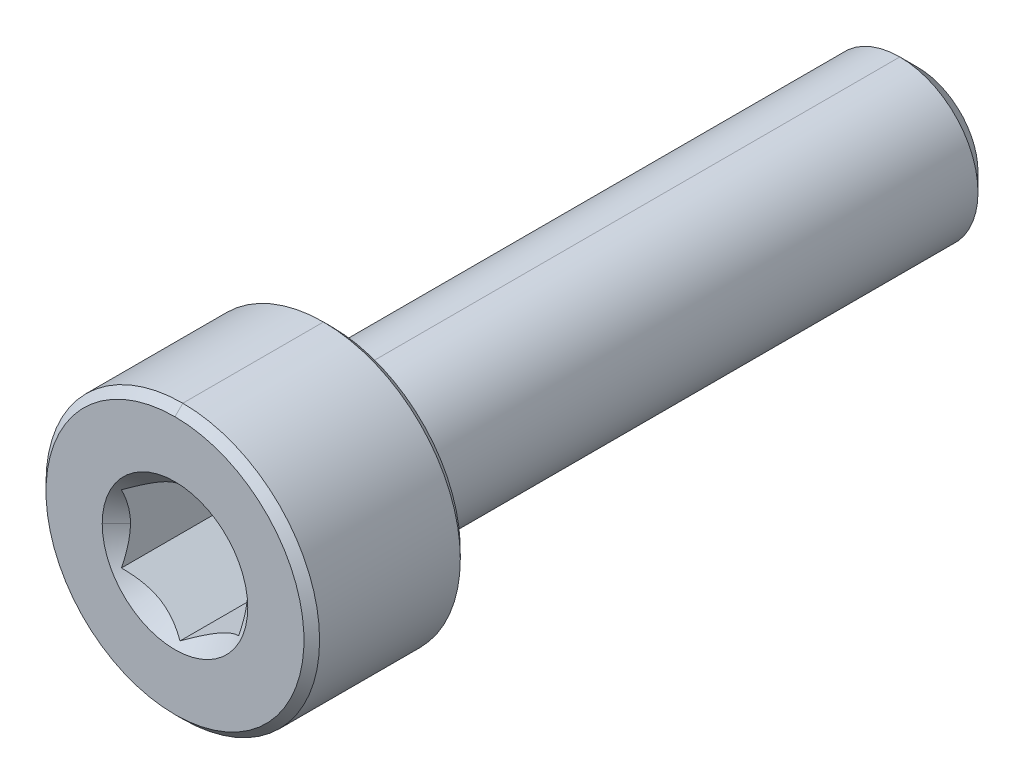
ISO-10303-21;
HEADER;
FILE_DESCRIPTION(('STEP AP214'),'2;1');
FILE_NAME('part.step','',(''),(''),'','','');
FILE_SCHEMA(('AUTOMOTIVE_DESIGN { 1 0 10303 214 1 1 1 1 }'));
ENDSEC;
DATA;
#1=APPLICATION_CONTEXT('core data for automotive mechanical design processes');
#2=APPLICATION_PROTOCOL_DEFINITION('international standard','automotive_design',2000,#1);
#3=PRODUCT_CONTEXT('',#1,'mechanical');
#4=PRODUCT('Part','Part','',(#3));
#5=PRODUCT_RELATED_PRODUCT_CATEGORY('part','',(#4));
#6=PRODUCT_DEFINITION_FORMATION('','',#4);
#7=PRODUCT_DEFINITION_CONTEXT('part definition',#1,'design');
#8=PRODUCT_DEFINITION('design','',#6,#7);
#9=PRODUCT_DEFINITION_SHAPE('','',#8);
#10=(LENGTH_UNIT() NAMED_UNIT(*) SI_UNIT(.MILLI.,.METRE.));
#11=(NAMED_UNIT(*) PLANE_ANGLE_UNIT() SI_UNIT($,.RADIAN.));
#12=(NAMED_UNIT(*) SI_UNIT($,.STERADIAN.) SOLID_ANGLE_UNIT());
#13=UNCERTAINTY_MEASURE_WITH_UNIT(LENGTH_MEASURE(1.E-05),#10,'distance_accuracy_value','');
#14=(GEOMETRIC_REPRESENTATION_CONTEXT(3) GLOBAL_UNCERTAINTY_ASSIGNED_CONTEXT((#13)) GLOBAL_UNIT_ASSIGNED_CONTEXT((#10,
#11,#12)) REPRESENTATION_CONTEXT('',''));
#15=CARTESIAN_POINT('',(0.,0.,0.));
#16=DIRECTION('',(0.,0.,1.));
#17=DIRECTION('',(1.,0.,0.));
#18=AXIS2_PLACEMENT_3D('',#15,#16,#17);
#19=CARTESIAN_POINT('',(1.5,-0.866025403784439,0.917424305044158));
#20=DIRECTION('',(1.,0.,0.));
#21=DIRECTION('',(0.,1.,0.));
#22=AXIS2_PLACEMENT_3D('',#19,#20,#21);
#23=PLANE('',#22);
#24=DIRECTION('',(0.,0.,1.));
#25=VECTOR('',#24,1.);
#26=CARTESIAN_POINT('',(1.5,-0.866025403784439,0.917424305044158));
#27=LINE('',#26,#25);
#28=CARTESIAN_POINT('',(1.5,-0.866025403784439,6.5));
#29=VERTEX_POINT('',#28);
#30=CARTESIAN_POINT('',(1.5,-0.866025403784439,9.37009618943233));
#31=VERTEX_POINT('',#30);
#32=EDGE_CURVE('E461',#29,#31,#27,.T.);
#33=ORIENTED_EDGE('',*,*,#32,.T.);
#34=CARTESIAN_POINT('',(1.5,-0.866025403784439,9.37009618943234));
#35=CARTESIAN_POINT('',(1.5,-0.401923788646697,9.13804538186346));
#36=CARTESIAN_POINT('',(1.5,0.,9.13804538186346));
#37=B_SPLINE_CURVE_WITH_KNOTS('',2,(#34,#35,#36),.UNSPECIFIED.,.F.,.F.,(3,3),(0.,1.),.UNSPECIFIED.);
#38=CARTESIAN_POINT('',(1.5,0.,9.13804538186346));
#39=VERTEX_POINT('',#38);
#40=EDGE_CURVE('E450',#31,#39,#37,.T.);
#41=ORIENTED_EDGE('',*,*,#40,.T.);
#42=CARTESIAN_POINT('',(1.5,0.,9.13804538186346));
#43=CARTESIAN_POINT('',(1.5,0.216977558745569,9.13804538186346));
#44=CARTESIAN_POINT('',(1.5,0.445753418709853,9.20287639839243));
#45=CARTESIAN_POINT('',(1.5,0.643872918489486,9.25901994678486));
#46=CARTESIAN_POINT('',(1.5,0.866025403784441,9.37009618943234));
#47=B_SPLINE_CURVE_WITH_KNOTS('',2,(#42,#43,#44,#45,#46),.UNSPECIFIED.,.F.,.F.,(3,2,3),(0.,0.5,
1.),.UNSPECIFIED.);
#48=CARTESIAN_POINT('',(1.5,0.866025403784439,9.37009618943233));
#49=VERTEX_POINT('',#48);
#50=EDGE_CURVE('E289',#39,#49,#47,.T.);
#51=ORIENTED_EDGE('',*,*,#50,.T.);
#52=DIRECTION('',(0.,0.,1.));
#53=VECTOR('',#52,1.);
#54=CARTESIAN_POINT('',(1.5,0.866025403784439,0.917424305044158));
#55=LINE('',#54,#53);
#56=CARTESIAN_POINT('',(1.5,0.866025403784439,6.5));
#57=VERTEX_POINT('',#56);
#58=EDGE_CURVE('E10',#57,#49,#55,.T.);
#59=ORIENTED_EDGE('',*,*,#58,.F.);
#60=DIRECTION('',(0.,1.,0.));
#61=VECTOR('',#60,1.);
#62=CARTESIAN_POINT('',(1.5,-0.866025403784439,6.5));
#63=LINE('',#62,#61);
#64=EDGE_CURVE('E266',#29,#57,#63,.T.);
#65=ORIENTED_EDGE('',*,*,#64,.F.);
#66=EDGE_LOOP('',(#33,#41,#51,#59,#65));
#67=FACE_BOUND('',#66,.T.);
#68=ADVANCED_FACE('F16',(#67),#23,.F.);
#69=CARTESIAN_POINT('',(1.5,0.866025403784439,0.917424305044158));
#70=DIRECTION('',(0.5,0.866025403784439,0.));
#71=DIRECTION('',(0.,0.,-1.));
#72=AXIS2_PLACEMENT_3D('',#69,#70,#71);
#73=PLANE('',#72);
#74=ORIENTED_EDGE('',*,*,#58,.T.);
#75=CARTESIAN_POINT('',(1.5,0.866025403784439,9.37009618943234));
#76=CARTESIAN_POINT('',(1.09983313245017,1.0970618524851,9.13905974073167));
#77=CARTESIAN_POINT('',(0.752762837135629,1.29744298091268,9.1380487744236));
#78=CARTESIAN_POINT('',(0.403679115740527,1.49898656142985,9.13703194329229));
#79=CARTESIAN_POINT('',(0.,1.73205080756888,9.37009618943234));
#80=B_SPLINE_CURVE_WITH_KNOTS('',2,(#75,#76,#77,#78,#79),.UNSPECIFIED.,.F.,.F.,(3,2,3),(0.,0.5,
1.),.UNSPECIFIED.);
#81=CARTESIAN_POINT('',(0.,1.73205080756888,9.37009618943233));
#82=VERTEX_POINT('',#81);
#83=EDGE_CURVE('E546',#49,#82,#80,.T.);
#84=ORIENTED_EDGE('',*,*,#83,.T.);
#85=DIRECTION('',(0.,0.,1.));
#86=VECTOR('',#85,1.);
#87=CARTESIAN_POINT('',(0.,1.73205080756888,0.917424305044158));
#88=LINE('',#87,#86);
#89=CARTESIAN_POINT('',(0.,1.73205080756887,6.5));
#90=VERTEX_POINT('',#89);
#91=EDGE_CURVE('E28',#90,#82,#88,.T.);
#92=ORIENTED_EDGE('',*,*,#91,.F.);
#93=DIRECTION('',(-0.866025403784439,0.5,0.));
#94=VECTOR('',#93,1.);
#95=CARTESIAN_POINT('',(1.5,0.866025403784439,6.5));
#96=LINE('',#95,#94);
#97=EDGE_CURVE('E270',#57,#90,#96,.T.);
#98=ORIENTED_EDGE('',*,*,#97,.F.);
#99=EDGE_LOOP('',(#74,#84,#92,#98));
#100=FACE_BOUND('',#99,.T.);
#101=ADVANCED_FACE('F526',(#100),#73,.F.);
#102=CARTESIAN_POINT('',(0.,1.73205080756888,0.917424305044158));
#103=DIRECTION('',(-0.5,0.866025403784438,0.));
#104=DIRECTION('',(0.,0.,1.));
#105=AXIS2_PLACEMENT_3D('',#102,#103,#104);
#106=PLANE('',#105);
#107=ORIENTED_EDGE('',*,*,#91,.T.);
#108=CARTESIAN_POINT('',(0.,1.73205080756888,9.37009618943234));
#109=CARTESIAN_POINT('',(-0.400166867550904,1.5010143588676,9.13905974073106));
#110=CARTESIAN_POINT('',(-0.74723716286437,1.30063323044064,9.1380487744236));
#111=CARTESIAN_POINT('',(-1.09632088426054,1.09908964992285,9.13703194329291));
#112=CARTESIAN_POINT('',(-1.5,0.866025403784442,9.37009618943234));
#113=B_SPLINE_CURVE_WITH_KNOTS('',2,(#108,#109,#110,#111,#112),.UNSPECIFIED.,.F.,.F.,(3,2,3),
(0.,0.5,1.),.UNSPECIFIED.);
#114=CARTESIAN_POINT('',(-1.5,0.866025403784438,9.37009618943233));
#115=VERTEX_POINT('',#114);
#116=EDGE_CURVE('E547',#82,#115,#113,.T.);
#117=ORIENTED_EDGE('',*,*,#116,.T.);
#118=DIRECTION('',(0.,0.,1.));
#119=VECTOR('',#118,1.);
#120=CARTESIAN_POINT('',(-1.5,0.866025403784438,0.917424305044158));
#121=LINE('',#120,#119);
#122=CARTESIAN_POINT('',(-1.5,0.866025403784438,6.5));
#123=VERTEX_POINT('',#122);
#124=EDGE_CURVE('E53',#123,#115,#121,.T.);
#125=ORIENTED_EDGE('',*,*,#124,.F.);
#126=DIRECTION('',(-0.866025403784438,-0.5,0.));
#127=VECTOR('',#126,1.);
#128=CARTESIAN_POINT('',(0.,1.73205080756888,6.5));
#129=LINE('',#128,#127);
#130=EDGE_CURVE('E272',#90,#123,#129,.T.);
#131=ORIENTED_EDGE('',*,*,#130,.F.);
#132=EDGE_LOOP('',(#107,#117,#125,#131));
#133=FACE_BOUND('',#132,.T.);
#134=ADVANCED_FACE('F365',(#133),#106,.F.);
#135=CARTESIAN_POINT('',(-1.5,0.866025403784438,0.917424305044158));
#136=DIRECTION('',(-1.,0.,0.));
#137=DIRECTION('',(0.,0.,1.));
#138=AXIS2_PLACEMENT_3D('',#135,#136,#137);
#139=PLANE('',#138);
#140=ORIENTED_EDGE('',*,*,#124,.T.);
#141=CARTESIAN_POINT('',(-1.5,0.866025403784438,9.37009618943234));
#142=CARTESIAN_POINT('',(-1.5,0.64659678172305,9.26038187840165));
#143=CARTESIAN_POINT('',(-1.5,0.445753418709853,9.20287639839243));
#144=CARTESIAN_POINT('',(-1.5,0.219324922066452,9.13804538186346));
#145=CARTESIAN_POINT('',(-1.5,0.,9.13804538186346));
#146=B_SPLINE_CURVE_WITH_KNOTS('',2,(#141,#142,#143,#144,#145),.UNSPECIFIED.,.F.,.F.,(3,2,3),
(0.,0.5,1.),.UNSPECIFIED.);
#147=CARTESIAN_POINT('',(-1.5,0.,9.13804538186346));
#148=VERTEX_POINT('',#147);
#149=EDGE_CURVE('E265',#115,#148,#146,.T.);
#150=ORIENTED_EDGE('',*,*,#149,.T.);
#151=CARTESIAN_POINT('',(-1.5,0.,9.13804538186346));
#152=CARTESIAN_POINT('',(-1.5,-0.401923788646698,9.13804538186346));
#153=CARTESIAN_POINT('',(-1.5,-0.866025403784437,9.37009618943234));
#154=B_SPLINE_CURVE_WITH_KNOTS('',2,(#151,#152,#153),.UNSPECIFIED.,.F.,.F.,(3,3),(0.,1.),.UNSPECIFIED.);
#155=CARTESIAN_POINT('',(-1.5,-0.866025403784439,9.37009618943233));
#156=VERTEX_POINT('',#155);
#157=EDGE_CURVE('E384',#148,#156,#154,.T.);
#158=ORIENTED_EDGE('',*,*,#157,.T.);
#159=DIRECTION('',(0.,0.,1.));
#160=VECTOR('',#159,1.);
#161=CARTESIAN_POINT('',(-1.5,-0.866025403784439,0.917424305044158));
#162=LINE('',#161,#160);
#163=CARTESIAN_POINT('',(-1.5,-0.866025403784439,6.5));
#164=VERTEX_POINT('',#163);
#165=EDGE_CURVE('E42',#164,#156,#162,.T.);
#166=ORIENTED_EDGE('',*,*,#165,.F.);
#167=DIRECTION('',(0.,-1.,0.));
#168=VECTOR('',#167,1.);
#169=CARTESIAN_POINT('',(-1.5,0.866025403784438,6.5));
#170=LINE('',#169,#168);
#171=EDGE_CURVE('E276',#123,#164,#170,.T.);
#172=ORIENTED_EDGE('',*,*,#171,.F.);
#173=EDGE_LOOP('',(#140,#150,#158,#166,#172));
#174=FACE_BOUND('',#173,.T.);
#175=ADVANCED_FACE('F354',(#174),#139,.F.);
#176=CARTESIAN_POINT('',(-1.5,-0.866025403784439,0.917424305044158));
#177=DIRECTION('',(-0.5,-0.866025403784439,0.));
#178=DIRECTION('',(-0.866025403784439,0.5,0.));
#179=AXIS2_PLACEMENT_3D('',#176,#177,#178);
#180=PLANE('',#179);
#181=ORIENTED_EDGE('',*,*,#165,.T.);
#182=CARTESIAN_POINT('',(-1.5,-0.866025403784439,9.37009618943233));
#183=CARTESIAN_POINT('',(-1.09983313244696,-1.09706185248695,9.13905974072982));
#184=CARTESIAN_POINT('',(-0.752762837135628,-1.29744298091268,9.1380487744236));
#185=CARTESIAN_POINT('',(-0.403679115737318,-1.49898656143171,9.13703194329414));
#186=CARTESIAN_POINT('',(0.,-1.73205080756888,9.37009618943233));
#187=B_SPLINE_CURVE_WITH_KNOTS('',2,(#182,#183,#184,#185,#186),.UNSPECIFIED.,.F.,.F.,(3,2,3),
(0.,0.5,1.),.UNSPECIFIED.);
#188=CARTESIAN_POINT('',(0.,-1.73205080756888,9.37009618943233));
#189=VERTEX_POINT('',#188);
#190=EDGE_CURVE('E390',#156,#189,#187,.T.);
#191=ORIENTED_EDGE('',*,*,#190,.T.);
#192=DIRECTION('',(0.,0.,1.));
#193=VECTOR('',#192,1.);
#194=CARTESIAN_POINT('',(0.,-1.73205080756888,0.917424305044158));
#195=LINE('',#194,#193);
#196=CARTESIAN_POINT('',(0.,-1.73205080756887,6.5));
#197=VERTEX_POINT('',#196);
#198=EDGE_CURVE('E284',#197,#189,#195,.T.);
#199=ORIENTED_EDGE('',*,*,#198,.F.);
#200=DIRECTION('',(0.866025403784439,-0.5,0.));
#201=VECTOR('',#200,1.);
#202=CARTESIAN_POINT('',(-1.5,-0.866025403784439,6.5));
#203=LINE('',#202,#201);
#204=EDGE_CURVE('E280',#164,#197,#203,.T.);
#205=ORIENTED_EDGE('',*,*,#204,.F.);
#206=EDGE_LOOP('',(#181,#191,#199,#205));
#207=FACE_BOUND('',#206,.T.);
#208=ADVANCED_FACE('F364',(#207),#180,.F.);
#209=CARTESIAN_POINT('',(0.,-1.73205080756888,0.917424305044158));
#210=DIRECTION('',(0.5,-0.866025403784439,0.));
#211=DIRECTION('',(0.,0.,-1.));
#212=AXIS2_PLACEMENT_3D('',#209,#210,#211);
#213=PLANE('',#212);
#214=ORIENTED_EDGE('',*,*,#198,.T.);
#215=CARTESIAN_POINT('',(0.,-1.73205080756888,9.37009618943234));
#216=CARTESIAN_POINT('',(0.400166867548767,-1.50101435886883,9.13905974073229));
#217=CARTESIAN_POINT('',(0.747237162864371,-1.30063323044064,9.1380487744236));
#218=CARTESIAN_POINT('',(1.09632088425841,-1.09908964992408,9.13703194329167));
#219=CARTESIAN_POINT('',(1.5,-0.866025403784442,9.37009618943234));
#220=B_SPLINE_CURVE_WITH_KNOTS('',2,(#215,#216,#217,#218,#219),.UNSPECIFIED.,.F.,.F.,(3,2,3),
(0.,0.5,1.),.UNSPECIFIED.);
#221=EDGE_CURVE('E477',#189,#31,#220,.T.);
#222=ORIENTED_EDGE('',*,*,#221,.T.);
#223=ORIENTED_EDGE('',*,*,#32,.F.);
#224=DIRECTION('',(0.866025403784439,0.5,0.));
#225=VECTOR('',#224,1.);
#226=CARTESIAN_POINT('',(0.,-1.73205080756888,6.5));
#227=LINE('',#226,#225);
#228=EDGE_CURVE('E271',#197,#29,#227,.T.);
#229=ORIENTED_EDGE('',*,*,#228,.F.);
#230=EDGE_LOOP('',(#214,#222,#223,#229));
#231=FACE_BOUND('',#230,.T.);
#232=ADVANCED_FACE('F480',(#231),#213,.F.);
#233=CARTESIAN_POINT('',(0.,3.3,6.5));
#234=DIRECTION('',(0.,0.,-1.));
#235=DIRECTION('',(0.,-1.,0.));
#236=AXIS2_PLACEMENT_3D('',#233,#234,#235);
#237=PLANE('',#236);
#238=ORIENTED_EDGE('',*,*,#228,.T.);
#239=ORIENTED_EDGE('',*,*,#64,.T.);
#240=ORIENTED_EDGE('',*,*,#97,.T.);
#241=ORIENTED_EDGE('',*,*,#130,.T.);
#242=ORIENTED_EDGE('',*,*,#171,.T.);
#243=ORIENTED_EDGE('',*,*,#204,.T.);
#244=EDGE_LOOP('',(#238,#239,#240,#241,#242,#243));
#245=FACE_BOUND('',#244,.T.);
#246=ADVANCED_FACE('F319',(#245),#237,.F.);
#247=CARTESIAN_POINT('',(0.,0.,9.5));
#248=DIRECTION('',(0.,0.,1.));
#249=DIRECTION('',(1.,0.,0.));
#250=AXIS2_PLACEMENT_3D('',#247,#248,#249);
#251=CONICAL_SURFACE('',#250,1.86195461813655,0.78539816339745);
#252=DIRECTION('',(-0.707106781186549,0.,0.707106781186546));
#253=VECTOR('',#252,1.);
#254=CARTESIAN_POINT('',(-1.86195461813655,0.,9.5));
#255=LINE('',#254,#253);
#256=CARTESIAN_POINT('',(-1.86195461813655,0.,9.5));
#257=VERTEX_POINT('',#256);
#258=EDGE_CURVE('E387',#148,#257,#255,.T.);
#259=ORIENTED_EDGE('',*,*,#258,.F.);
#260=ORIENTED_EDGE('',*,*,#149,.F.);
#261=ORIENTED_EDGE('',*,*,#116,.F.);
#262=ORIENTED_EDGE('',*,*,#83,.F.);
#263=ORIENTED_EDGE('',*,*,#50,.F.);
#264=DIRECTION('',(0.707106781186549,0.,0.707106781186546));
#265=VECTOR('',#264,1.);
#266=CARTESIAN_POINT('',(1.86195461813655,0.,9.5));
#267=LINE('',#266,#265);
#268=CARTESIAN_POINT('',(1.86195461813655,0.,9.5));
#269=VERTEX_POINT('',#268);
#270=EDGE_CURVE('E306',#39,#269,#267,.T.);
#271=ORIENTED_EDGE('',*,*,#270,.T.);
#272=CARTESIAN_POINT('',(0.,0.,9.5));
#273=DIRECTION('',(0.,0.,1.));
#274=DIRECTION('',(1.,0.,0.));
#275=AXIS2_PLACEMENT_3D('',#272,#273,#274);
#276=CIRCLE('',#275,1.86195461813655);
#277=EDGE_CURVE('E262',#269,#257,#276,.T.);
#278=ORIENTED_EDGE('',*,*,#277,.T.);
#279=EDGE_LOOP('',(#259,#260,#261,#262,#263,#271,#278));
#280=FACE_BOUND('',#279,.T.);
#281=ADVANCED_FACE('F308',(#280),#251,.F.);
#282=CARTESIAN_POINT('',(0.,0.,9.5));
#283=DIRECTION('',(0.,0.,1.));
#284=DIRECTION('',(0.,-1.,0.));
#285=AXIS2_PLACEMENT_3D('',#282,#283,#284);
#286=PLANE('',#285);
#287=ORIENTED_EDGE('',*,*,#277,.F.);
#288=CARTESIAN_POINT('',(0.,0.,9.5));
#289=DIRECTION('',(0.,0.,1.));
#290=DIRECTION('',(1.,0.,0.));
#291=AXIS2_PLACEMENT_3D('',#288,#289,#290);
#292=CIRCLE('',#291,1.86195461813655);
#293=EDGE_CURVE('E395',#257,#269,#292,.T.);
#294=ORIENTED_EDGE('',*,*,#293,.F.);
#295=EDGE_LOOP('',(#287,#294));
#296=FACE_BOUND('',#295,.T.);
#297=CARTESIAN_POINT('',(0.,0.,9.5));
#298=DIRECTION('',(0.,0.,-1.));
#299=DIRECTION('',(0.,1.,0.));
#300=AXIS2_PLACEMENT_3D('',#297,#298,#299);
#301=CIRCLE('',#300,3.3);
#302=CARTESIAN_POINT('',(0.,3.3,9.5));
#303=VERTEX_POINT('',#302);
#304=CARTESIAN_POINT('',(0.,-3.3,9.5));
#305=VERTEX_POINT('',#304);
#306=EDGE_CURVE('E669',#303,#305,#301,.T.);
#307=ORIENTED_EDGE('',*,*,#306,.F.);
#308=CARTESIAN_POINT('',(0.,0.,9.5));
#309=DIRECTION('',(0.,0.,-1.));
#310=DIRECTION('',(0.,1.,0.));
#311=AXIS2_PLACEMENT_3D('',#308,#309,#310);
#312=CIRCLE('',#311,3.3);
#313=EDGE_CURVE('E259',#305,#303,#312,.T.);
#314=ORIENTED_EDGE('',*,*,#313,.F.);
#315=EDGE_LOOP('',(#307,#314));
#316=FACE_BOUND('',#315,.T.);
#317=ADVANCED_FACE('F318',(#296,#316),#286,.T.);
#318=CARTESIAN_POINT('',(0.,0.,9.3));
#319=DIRECTION('',(0.,0.,-1.));
#320=DIRECTION('',(0.,1.,0.));
#321=AXIS2_PLACEMENT_3D('',#318,#319,#320);
#322=CONICAL_SURFACE('',#321,3.5,0.785398163397443);
#323=DIRECTION('',(0.,-0.707106781186544,-0.707106781186552));
#324=VECTOR('',#323,1.);
#325=CARTESIAN_POINT('',(0.,-3.5,9.3));
#326=LINE('',#325,#324);
#327=CARTESIAN_POINT('',(0.,-3.5,9.3));
#328=VERTEX_POINT('',#327);
#329=EDGE_CURVE('E662',#305,#328,#326,.T.);
#330=ORIENTED_EDGE('',*,*,#329,.F.);
#331=ORIENTED_EDGE('',*,*,#313,.T.);
#332=DIRECTION('',(0.,0.707106781186544,-0.707106781186552));
#333=VECTOR('',#332,1.);
#334=CARTESIAN_POINT('',(0.,3.5,9.3));
#335=LINE('',#334,#333);
#336=CARTESIAN_POINT('',(0.,3.5,9.3));
#337=VERTEX_POINT('',#336);
#338=EDGE_CURVE('E649',#303,#337,#335,.T.);
#339=ORIENTED_EDGE('',*,*,#338,.T.);
#340=CARTESIAN_POINT('',(0.,0.,9.3));
#341=DIRECTION('',(0.,0.,-1.));
#342=DIRECTION('',(0.,1.,0.));
#343=AXIS2_PLACEMENT_3D('',#340,#341,#342);
#344=CIRCLE('',#343,3.5);
#345=EDGE_CURVE('E256',#328,#337,#344,.T.);
#346=ORIENTED_EDGE('',*,*,#345,.F.);
#347=EDGE_LOOP('',(#330,#331,#339,#346));
#348=FACE_BOUND('',#347,.T.);
#349=ADVANCED_FACE('F496',(#348),#322,.T.);
#350=CARTESIAN_POINT('',(0.,0.,-9.5));
#351=DIRECTION('',(0.,0.,-1.));
#352=DIRECTION('',(0.,1.,0.));
#353=AXIS2_PLACEMENT_3D('',#350,#351,#352);
#354=CYLINDRICAL_SURFACE('',#353,3.5);
#355=DIRECTION('',(0.,0.,-1.));
#356=VECTOR('',#355,1.);
#357=CARTESIAN_POINT('',(0.,-3.5,-9.5));
#358=LINE('',#357,#356);
#359=CARTESIAN_POINT('',(0.,-3.5,5.7));
#360=VERTEX_POINT('',#359);
#361=EDGE_CURVE('E643',#328,#360,#358,.T.);
#362=ORIENTED_EDGE('',*,*,#361,.F.);
#363=ORIENTED_EDGE('',*,*,#345,.T.);
#364=DIRECTION('',(0.,0.,-1.));
#365=VECTOR('',#364,1.);
#366=CARTESIAN_POINT('',(0.,3.5,-9.5));
#367=LINE('',#366,#365);
#368=CARTESIAN_POINT('',(0.,3.5,5.7));
#369=VERTEX_POINT('',#368);
#370=EDGE_CURVE('E200',#337,#369,#367,.T.);
#371=ORIENTED_EDGE('',*,*,#370,.T.);
#372=CARTESIAN_POINT('',(0.,0.,5.7));
#373=DIRECTION('',(0.,0.,-1.));
#374=DIRECTION('',(0.,1.,0.));
#375=AXIS2_PLACEMENT_3D('',#372,#373,#374);
#376=CIRCLE('',#375,3.5);
#377=EDGE_CURVE('E186',#360,#369,#376,.T.);
#378=ORIENTED_EDGE('',*,*,#377,.F.);
#379=EDGE_LOOP('',(#362,#363,#371,#378));
#380=FACE_BOUND('',#379,.T.);
#381=ADVANCED_FACE('F429',(#380),#354,.T.);
#382=CARTESIAN_POINT('',(0.,0.,5.5));
#383=DIRECTION('',(0.,0.,1.));
#384=DIRECTION('',(0.,-1.,0.));
#385=AXIS2_PLACEMENT_3D('',#382,#383,#384);
#386=CONICAL_SURFACE('',#385,3.3,0.785398163397452);
#387=DIRECTION('',(0.,0.70710678118655,0.707106781186545));
#388=VECTOR('',#387,1.);
#389=CARTESIAN_POINT('',(0.,3.3,5.5));
#390=LINE('',#389,#388);
#391=CARTESIAN_POINT('',(0.,3.3,5.5));
#392=VERTEX_POINT('',#391);
#393=EDGE_CURVE('E181',#392,#369,#390,.T.);
#394=ORIENTED_EDGE('',*,*,#393,.F.);
#395=CARTESIAN_POINT('',(0.,0.,5.5));
#396=DIRECTION('',(0.,0.,-1.));
#397=DIRECTION('',(0.,1.,0.));
#398=AXIS2_PLACEMENT_3D('',#395,#396,#397);
#399=CIRCLE('',#398,3.3);
#400=CARTESIAN_POINT('',(0.,-3.3,5.5));
#401=VERTEX_POINT('',#400);
#402=EDGE_CURVE('E175',#401,#392,#399,.T.);
#403=ORIENTED_EDGE('',*,*,#402,.F.);
#404=DIRECTION('',(0.,-0.70710678118655,0.707106781186545));
#405=VECTOR('',#404,1.);
#406=CARTESIAN_POINT('',(0.,-3.3,5.5));
#407=LINE('',#406,#405);
#408=EDGE_CURVE('E178',#401,#360,#407,.T.);
#409=ORIENTED_EDGE('',*,*,#408,.T.);
#410=ORIENTED_EDGE('',*,*,#377,.T.);
#411=EDGE_LOOP('',(#394,#403,#409,#410));
#412=FACE_BOUND('',#411,.T.);
#413=ADVANCED_FACE('F177',(#412),#386,.T.);
#414=CARTESIAN_POINT('',(0.,3.3,5.5));
#415=DIRECTION('',(0.,0.,-1.));
#416=DIRECTION('',(0.,-1.,0.));
#417=AXIS2_PLACEMENT_3D('',#414,#415,#416);
#418=PLANE('',#417);
#419=CARTESIAN_POINT('',(0.,0.,5.5));
#420=DIRECTION('',(0.,0.,-1.));
#421=DIRECTION('',(0.,1.,0.));
#422=AXIS2_PLACEMENT_3D('',#419,#420,#421);
#423=CIRCLE('',#422,2.2);
#424=CARTESIAN_POINT('',(0.,2.2,5.5));
#425=VERTEX_POINT('',#424);
#426=CARTESIAN_POINT('',(0.,-2.2,5.5));
#427=VERTEX_POINT('',#426);
#428=EDGE_CURVE('E187',#425,#427,#423,.T.);
#429=ORIENTED_EDGE('',*,*,#428,.F.);
#430=CARTESIAN_POINT('',(0.,0.,5.5));
#431=DIRECTION('',(0.,0.,-1.));
#432=DIRECTION('',(0.,1.,0.));
#433=AXIS2_PLACEMENT_3D('',#430,#431,#432);
#434=CIRCLE('',#433,2.2);
#435=EDGE_CURVE('E224',#427,#425,#434,.T.);
#436=ORIENTED_EDGE('',*,*,#435,.F.);
#437=EDGE_LOOP('',(#429,#436));
#438=FACE_BOUND('',#437,.T.);
#439=ORIENTED_EDGE('',*,*,#402,.T.);
#440=CARTESIAN_POINT('',(0.,0.,5.5));
#441=DIRECTION('',(0.,0.,-1.));
#442=DIRECTION('',(0.,1.,0.));
#443=AXIS2_PLACEMENT_3D('',#440,#441,#442);
#444=CIRCLE('',#443,3.3);
#445=EDGE_CURVE('E191',#392,#401,#444,.T.);
#446=ORIENTED_EDGE('',*,*,#445,.T.);
#447=EDGE_LOOP('',(#439,#446));
#448=FACE_BOUND('',#447,.T.);
#449=ADVANCED_FACE('F198',(#438,#448),#418,.T.);
#450=CARTESIAN_POINT('',(0.,0.,5.3));
#451=DIRECTION('',(0.,0.,-1.));
#452=DIRECTION('',(0.,1.,0.));
#453=AXIS2_PLACEMENT_3D('',#450,#451,#452);
#454=TOROIDAL_SURFACE('',#453,2.2,0.2);
#455=CARTESIAN_POINT('',(0.,-2.2,5.3));
#456=DIRECTION('',(1.,0.,0.));
#457=DIRECTION('',(0.,1.,0.));
#458=AXIS2_PLACEMENT_3D('',#455,#456,#457);
#459=CIRCLE('',#458,0.2);
#460=CARTESIAN_POINT('',(0.,-2.,5.3));
#461=VERTEX_POINT('',#460);
#462=EDGE_CURVE('E220',#461,#427,#459,.T.);
#463=ORIENTED_EDGE('',*,*,#462,.F.);
#464=CARTESIAN_POINT('',(0.,0.,5.3));
#465=DIRECTION('',(0.,0.,-1.));
#466=DIRECTION('',(0.,1.,0.));
#467=AXIS2_PLACEMENT_3D('',#464,#465,#466);
#468=CIRCLE('',#467,2.);
#469=CARTESIAN_POINT('',(0.,2.,5.3));
#470=VERTEX_POINT('',#469);
#471=EDGE_CURVE('E211',#470,#461,#468,.T.);
#472=ORIENTED_EDGE('',*,*,#471,.F.);
#473=CARTESIAN_POINT('',(0.,2.2,5.3));
#474=DIRECTION('',(-1.,0.,0.));
#475=DIRECTION('',(0.,0.,1.));
#476=AXIS2_PLACEMENT_3D('',#473,#474,#475);
#477=CIRCLE('',#476,0.2);
#478=EDGE_CURVE('E216',#470,#425,#477,.T.);
#479=ORIENTED_EDGE('',*,*,#478,.T.);
#480=ORIENTED_EDGE('',*,*,#428,.T.);
#481=EDGE_LOOP('',(#463,#472,#479,#480));
#482=FACE_BOUND('',#481,.T.);
#483=ADVANCED_FACE('F494',(#482),#454,.F.);
#484=CARTESIAN_POINT('',(0.,0.,-9.5));
#485=DIRECTION('',(0.,0.,-1.));
#486=DIRECTION('',(0.,1.,0.));
#487=AXIS2_PLACEMENT_3D('',#484,#485,#486);
#488=CYLINDRICAL_SURFACE('',#487,2.);
#489=DIRECTION('',(0.,0.,-1.));
#490=VECTOR('',#489,1.);
#491=CARTESIAN_POINT('',(0.,-2.,-9.5));
#492=LINE('',#491,#490);
#493=CARTESIAN_POINT('',(0.,-2.,-9.04533666301317));
#494=VERTEX_POINT('',#493);
#495=EDGE_CURVE('E215',#461,#494,#492,.T.);
#496=ORIENTED_EDGE('',*,*,#495,.F.);
#497=CARTESIAN_POINT('',(0.,0.,5.3));
#498=DIRECTION('',(0.,0.,-1.));
#499=DIRECTION('',(0.,1.,0.));
#500=AXIS2_PLACEMENT_3D('',#497,#498,#499);
#501=CIRCLE('',#500,2.);
#502=EDGE_CURVE('E196',#461,#470,#501,.T.);
#503=ORIENTED_EDGE('',*,*,#502,.T.);
#504=DIRECTION('',(0.,0.,-1.));
#505=VECTOR('',#504,1.);
#506=CARTESIAN_POINT('',(0.,2.,-9.5));
#507=LINE('',#506,#505);
#508=CARTESIAN_POINT('',(0.,2.,-9.04533666301317));
#509=VERTEX_POINT('',#508);
#510=EDGE_CURVE('E232',#470,#509,#507,.T.);
#511=ORIENTED_EDGE('',*,*,#510,.T.);
#512=CARTESIAN_POINT('',(0.,0.,-9.04533666301317));
#513=DIRECTION('',(0.,0.,-1.));
#514=DIRECTION('',(0.,1.,0.));
#515=AXIS2_PLACEMENT_3D('',#512,#513,#514);
#516=CIRCLE('',#515,2.);
#517=EDGE_CURVE('E251',#494,#509,#516,.T.);
#518=ORIENTED_EDGE('',*,*,#517,.F.);
#519=EDGE_LOOP('',(#496,#503,#511,#518));
#520=FACE_BOUND('',#519,.T.);
#521=ADVANCED_FACE('F500',(#520),#488,.T.);
#522=CARTESIAN_POINT('',(0.,0.,-9.5));
#523=DIRECTION('',(0.,0.,1.));
#524=DIRECTION('',(0.,-1.,0.));
#525=AXIS2_PLACEMENT_3D('',#522,#523,#524);
#526=CONICAL_SURFACE('',#525,1.54533666301317,0.785398163397447);
#527=DIRECTION('',(0.,0.707106781186546,0.707106781186549));
#528=VECTOR('',#527,1.);
#529=CARTESIAN_POINT('',(0.,1.54533666301317,-9.5));
#530=LINE('',#529,#528);
#531=CARTESIAN_POINT('',(0.,1.54533666301317,-9.5));
#532=VERTEX_POINT('',#531);
#533=EDGE_CURVE('E240',#532,#509,#530,.T.);
#534=ORIENTED_EDGE('',*,*,#533,.F.);
#535=CARTESIAN_POINT('',(0.,0.,-9.5));
#536=DIRECTION('',(0.,0.,-1.));
#537=DIRECTION('',(0.,1.,0.));
#538=AXIS2_PLACEMENT_3D('',#535,#536,#537);
#539=CIRCLE('',#538,1.54533666301317);
#540=CARTESIAN_POINT('',(0.,-1.54533666301317,-9.5));
#541=VERTEX_POINT('',#540);
#542=EDGE_CURVE('E248',#541,#532,#539,.T.);
#543=ORIENTED_EDGE('',*,*,#542,.F.);
#544=DIRECTION('',(0.,-0.707106781186546,0.707106781186549));
#545=VECTOR('',#544,1.);
#546=CARTESIAN_POINT('',(0.,-1.54533666301317,-9.5));
#547=LINE('',#546,#545);
#548=EDGE_CURVE('E244',#541,#494,#547,.T.);
#549=ORIENTED_EDGE('',*,*,#548,.T.);
#550=ORIENTED_EDGE('',*,*,#517,.T.);
#551=EDGE_LOOP('',(#534,#543,#549,#550));
#552=FACE_BOUND('',#551,.T.);
#553=ADVANCED_FACE('F503',(#552),#526,.T.);
#554=CARTESIAN_POINT('',(0.,1.54533666301317,-9.5));
#555=DIRECTION('',(0.,0.,-1.));
#556=DIRECTION('',(0.,-1.,0.));
#557=AXIS2_PLACEMENT_3D('',#554,#555,#556);
#558=PLANE('',#557);
#559=ORIENTED_EDGE('',*,*,#542,.T.);
#560=CARTESIAN_POINT('',(0.,0.,-9.5));
#561=DIRECTION('',(0.,0.,-1.));
#562=DIRECTION('',(0.,1.,0.));
#563=AXIS2_PLACEMENT_3D('',#560,#561,#562);
#564=CIRCLE('',#563,1.54533666301317);
#565=EDGE_CURVE('E235',#532,#541,#564,.T.);
#566=ORIENTED_EDGE('',*,*,#565,.T.);
#567=EDGE_LOOP('',(#559,#566));
#568=FACE_BOUND('',#567,.T.);
#569=ADVANCED_FACE('F507',(#568),#558,.T.);
#570=CARTESIAN_POINT('',(0.,0.,-9.5));
#571=DIRECTION('',(0.,0.,1.));
#572=DIRECTION('',(0.,-1.,0.));
#573=AXIS2_PLACEMENT_3D('',#570,#571,#572);
#574=CONICAL_SURFACE('',#573,1.54533666301317,0.785398163397447);
#575=ORIENTED_EDGE('',*,*,#565,.F.);
#576=ORIENTED_EDGE('',*,*,#533,.T.);
#577=CARTESIAN_POINT('',(0.,0.,-9.04533666301317));
#578=DIRECTION('',(0.,0.,-1.));
#579=DIRECTION('',(0.,1.,0.));
#580=AXIS2_PLACEMENT_3D('',#577,#578,#579);
#581=CIRCLE('',#580,2.);
#582=EDGE_CURVE('E228',#509,#494,#581,.T.);
#583=ORIENTED_EDGE('',*,*,#582,.T.);
#584=ORIENTED_EDGE('',*,*,#548,.F.);
#585=EDGE_LOOP('',(#575,#576,#583,#584));
#586=FACE_BOUND('',#585,.T.);
#587=ADVANCED_FACE('F512',(#586),#574,.T.);
#588=CARTESIAN_POINT('',(0.,0.,-9.5));
#589=DIRECTION('',(0.,0.,-1.));
#590=DIRECTION('',(0.,1.,0.));
#591=AXIS2_PLACEMENT_3D('',#588,#589,#590);
#592=CYLINDRICAL_SURFACE('',#591,2.);
#593=ORIENTED_EDGE('',*,*,#471,.T.);
#594=ORIENTED_EDGE('',*,*,#495,.T.);
#595=ORIENTED_EDGE('',*,*,#582,.F.);
#596=ORIENTED_EDGE('',*,*,#510,.F.);
#597=EDGE_LOOP('',(#593,#594,#595,#596));
#598=FACE_BOUND('',#597,.T.);
#599=ADVANCED_FACE('F515',(#598),#592,.T.);
#600=CARTESIAN_POINT('',(0.,0.,5.3));
#601=DIRECTION('',(0.,0.,-1.));
#602=DIRECTION('',(0.,1.,0.));
#603=AXIS2_PLACEMENT_3D('',#600,#601,#602);
#604=TOROIDAL_SURFACE('',#603,2.2,0.2);
#605=ORIENTED_EDGE('',*,*,#502,.F.);
#606=ORIENTED_EDGE('',*,*,#462,.T.);
#607=ORIENTED_EDGE('',*,*,#435,.T.);
#608=ORIENTED_EDGE('',*,*,#478,.F.);
#609=EDGE_LOOP('',(#605,#606,#607,#608));
#610=FACE_BOUND('',#609,.T.);
#611=ADVANCED_FACE('F517',(#610),#604,.F.);
#612=CARTESIAN_POINT('',(0.,0.,5.5));
#613=DIRECTION('',(0.,0.,1.));
#614=DIRECTION('',(0.,-1.,0.));
#615=AXIS2_PLACEMENT_3D('',#612,#613,#614);
#616=CONICAL_SURFACE('',#615,3.3,0.785398163397452);
#617=ORIENTED_EDGE('',*,*,#445,.F.);
#618=ORIENTED_EDGE('',*,*,#393,.T.);
#619=CARTESIAN_POINT('',(0.,0.,5.7));
#620=DIRECTION('',(0.,0.,-1.));
#621=DIRECTION('',(0.,1.,0.));
#622=AXIS2_PLACEMENT_3D('',#619,#620,#621);
#623=CIRCLE('',#622,3.5);
#624=EDGE_CURVE('E193',#369,#360,#623,.T.);
#625=ORIENTED_EDGE('',*,*,#624,.T.);
#626=ORIENTED_EDGE('',*,*,#408,.F.);
#627=EDGE_LOOP('',(#617,#618,#625,#626));
#628=FACE_BOUND('',#627,.T.);
#629=ADVANCED_FACE('F190',(#628),#616,.T.);
#630=CARTESIAN_POINT('',(0.,0.,-9.5));
#631=DIRECTION('',(0.,0.,-1.));
#632=DIRECTION('',(0.,1.,0.));
#633=AXIS2_PLACEMENT_3D('',#630,#631,#632);
#634=CYLINDRICAL_SURFACE('',#633,3.5);
#635=CARTESIAN_POINT('',(0.,0.,9.3));
#636=DIRECTION('',(0.,0.,-1.));
#637=DIRECTION('',(0.,1.,0.));
#638=AXIS2_PLACEMENT_3D('',#635,#636,#637);
#639=CIRCLE('',#638,3.5);
#640=EDGE_CURVE('E656',#337,#328,#639,.T.);
#641=ORIENTED_EDGE('',*,*,#640,.T.);
#642=ORIENTED_EDGE('',*,*,#361,.T.);
#643=ORIENTED_EDGE('',*,*,#624,.F.);
#644=ORIENTED_EDGE('',*,*,#370,.F.);
#645=EDGE_LOOP('',(#641,#642,#643,#644));
#646=FACE_BOUND('',#645,.T.);
#647=ADVANCED_FACE('F762',(#646),#634,.T.);
#648=CARTESIAN_POINT('',(0.,0.,9.3));
#649=DIRECTION('',(0.,0.,-1.));
#650=DIRECTION('',(0.,1.,0.));
#651=AXIS2_PLACEMENT_3D('',#648,#649,#650);
#652=CONICAL_SURFACE('',#651,3.5,0.785398163397443);
#653=ORIENTED_EDGE('',*,*,#306,.T.);
#654=ORIENTED_EDGE('',*,*,#329,.T.);
#655=ORIENTED_EDGE('',*,*,#640,.F.);
#656=ORIENTED_EDGE('',*,*,#338,.F.);
#657=EDGE_LOOP('',(#653,#654,#655,#656));
#658=FACE_BOUND('',#657,.T.);
#659=ADVANCED_FACE('F428',(#658),#652,.T.);
#660=CARTESIAN_POINT('',(0.,0.,9.5));
#661=DIRECTION('',(0.,0.,1.));
#662=DIRECTION('',(1.,0.,0.));
#663=AXIS2_PLACEMENT_3D('',#660,#661,#662);
#664=CONICAL_SURFACE('',#663,1.86195461813655,0.78539816339745);
#665=ORIENTED_EDGE('',*,*,#157,.F.);
#666=ORIENTED_EDGE('',*,*,#258,.T.);
#667=ORIENTED_EDGE('',*,*,#293,.T.);
#668=ORIENTED_EDGE('',*,*,#270,.F.);
#669=ORIENTED_EDGE('',*,*,#40,.F.);
#670=ORIENTED_EDGE('',*,*,#221,.F.);
#671=ORIENTED_EDGE('',*,*,#190,.F.);
#672=EDGE_LOOP('',(#665,#666,#667,#668,#669,#670,#671));
#673=FACE_BOUND('',#672,.T.);
#674=ADVANCED_FACE('F385',(#673),#664,.F.);
#675=CLOSED_SHELL('',(#68,#101,#134,#175,#208,#232,#246,#281,#317,#349,#381,#413,#449,#483,#521,
#553,#569,#587,#599,#611,#629,#647,#659,#674));
#676=MANIFOLD_SOLID_BREP('B1',#675);
#677=ADVANCED_BREP_SHAPE_REPRESENTATION('',(#18,#676),#14);
#678=SHAPE_DEFINITION_REPRESENTATION(#9,#677);
ENDSEC;
END-ISO-10303-21;
